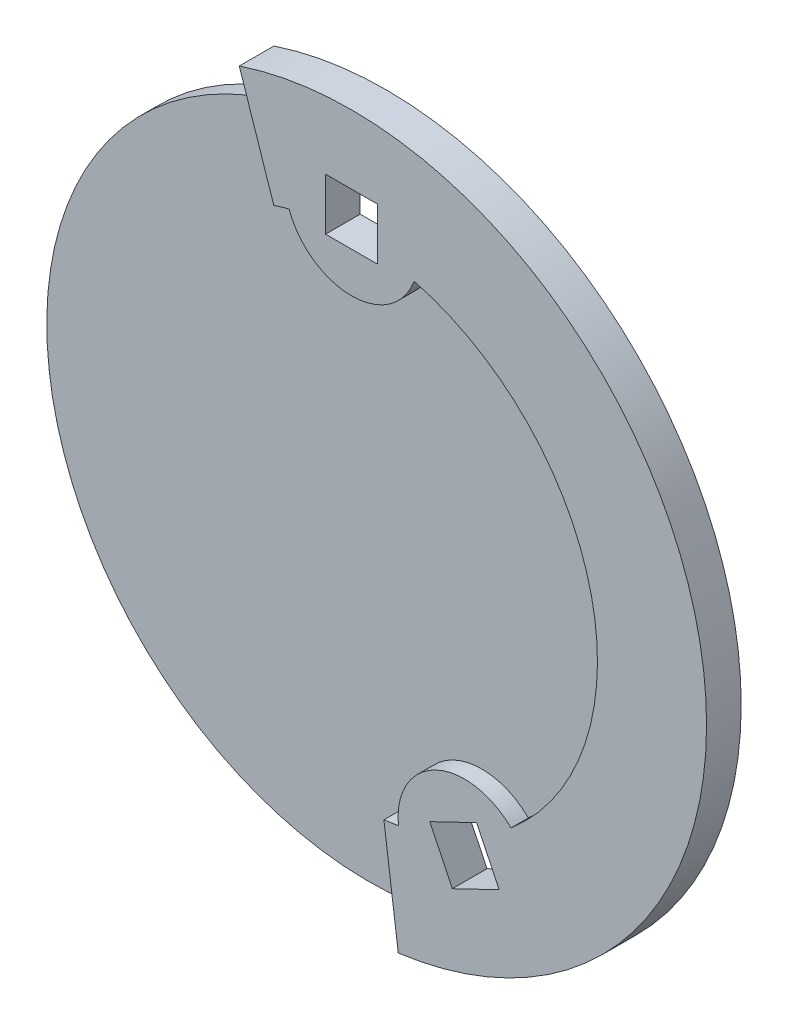
ISO-10303-21;
HEADER;
FILE_DESCRIPTION(('STEP AP214'),'2;1');
FILE_NAME('part.step','',(''),(''),'','','');
FILE_SCHEMA(('AUTOMOTIVE_DESIGN { 1 0 10303 214 1 1 1 1 }'));
ENDSEC;
DATA;
#1=APPLICATION_CONTEXT('core data for automotive mechanical design processes');
#2=APPLICATION_PROTOCOL_DEFINITION('international standard','automotive_design',2000,#1);
#3=PRODUCT_CONTEXT('',#1,'mechanical');
#4=PRODUCT('Part','Part','',(#3));
#5=PRODUCT_RELATED_PRODUCT_CATEGORY('part','',(#4));
#6=PRODUCT_DEFINITION_FORMATION('','',#4);
#7=PRODUCT_DEFINITION_CONTEXT('part definition',#1,'design');
#8=PRODUCT_DEFINITION('design','',#6,#7);
#9=PRODUCT_DEFINITION_SHAPE('','',#8);
#10=(LENGTH_UNIT() NAMED_UNIT(*) SI_UNIT(.MILLI.,.METRE.));
#11=(NAMED_UNIT(*) PLANE_ANGLE_UNIT() SI_UNIT($,.RADIAN.));
#12=(NAMED_UNIT(*) SI_UNIT($,.STERADIAN.) SOLID_ANGLE_UNIT());
#13=UNCERTAINTY_MEASURE_WITH_UNIT(LENGTH_MEASURE(1.E-05),#10,'distance_accuracy_value','');
#14=(GEOMETRIC_REPRESENTATION_CONTEXT(3) GLOBAL_UNCERTAINTY_ASSIGNED_CONTEXT((#13)) GLOBAL_UNIT_ASSIGNED_CONTEXT((#10,
#11,#12)) REPRESENTATION_CONTEXT('',''));
#15=CARTESIAN_POINT('',(0.,0.,0.));
#16=DIRECTION('',(0.,0.,1.));
#17=DIRECTION('',(1.,0.,0.));
#18=AXIS2_PLACEMENT_3D('',#15,#16,#17);
#19=CARTESIAN_POINT('',(0.,0.,1.));
#20=DIRECTION('',(-0.948679561183961,-0.316238976395711,0.));
#21=DIRECTION('',(0.316238976395711,-0.948679561183961,0.));
#22=AXIS2_PLACEMENT_3D('',#19,#20,#21);
#23=PLANE('',#22);
#24=DIRECTION('',(-0.316238976395711,0.948679561183961,0.));
#25=VECTOR('',#24,1.);
#26=CARTESIAN_POINT('',(0.,0.,0.));
#27=LINE('',#26,#25);
#28=CARTESIAN_POINT('',(-5.88204496096024,17.6454398380217,0.));
#29=VERTEX_POINT('',#28);
#30=CARTESIAN_POINT('',(-6.48289901611209,19.4479310042712,0.));
#31=VERTEX_POINT('',#30);
#32=EDGE_CURVE('E310',#29,#31,#27,.T.);
#33=ORIENTED_EDGE('',*,*,#32,.F.);
#34=DIRECTION('',(0.,0.,-1.));
#35=VECTOR('',#34,1.);
#36=CARTESIAN_POINT('',(-5.88204496096024,17.6454398380217,1.));
#37=LINE('',#36,#35);
#38=CARTESIAN_POINT('',(-5.88204496096024,17.6454398380217,1.));
#39=VERTEX_POINT('',#38);
#40=EDGE_CURVE('E312',#39,#29,#37,.T.);
#41=ORIENTED_EDGE('',*,*,#40,.F.);
#42=DIRECTION('',(0.316238976395712,-0.948679561183961,0.));
#43=VECTOR('',#42,1.);
#44=CARTESIAN_POINT('',(-4.49059346481916,13.4712497688124,1.));
#45=LINE('',#44,#43);
#46=CARTESIAN_POINT('',(-4.49059346481916,13.4712497688124,1.));
#47=VERTEX_POINT('',#46);
#48=EDGE_CURVE('E268',#39,#47,#45,.T.);
#49=ORIENTED_EDGE('',*,*,#48,.T.);
#50=DIRECTION('',(0.,0.,-1.));
#51=VECTOR('',#50,1.);
#52=CARTESIAN_POINT('',(-4.49059346481916,13.4712497688124,2.));
#53=LINE('',#52,#51);
#54=CARTESIAN_POINT('',(-4.49059346481916,13.4712497688124,2.));
#55=VERTEX_POINT('',#54);
#56=EDGE_CURVE('E235',#55,#47,#53,.T.);
#57=ORIENTED_EDGE('',*,*,#56,.F.);
#58=DIRECTION('',(0.316238976395712,-0.948679561183961,0.));
#59=VECTOR('',#58,1.);
#60=CARTESIAN_POINT('',(-4.49059346481916,13.4712497688124,2.));
#61=LINE('',#60,#59);
#62=CARTESIAN_POINT('',(-6.48289901611209,19.4479310042712,2.));
#63=VERTEX_POINT('',#62);
#64=EDGE_CURVE('E233',#63,#55,#61,.T.);
#65=ORIENTED_EDGE('',*,*,#64,.F.);
#66=DIRECTION('',(0.,0.,-1.));
#67=VECTOR('',#66,1.);
#68=CARTESIAN_POINT('',(-6.48289901611209,19.4479310042712,1.));
#69=LINE('',#68,#67);
#70=EDGE_CURVE('E315',#63,#31,#69,.T.);
#71=ORIENTED_EDGE('',*,*,#70,.T.);
#72=EDGE_LOOP('',(#33,#41,#49,#57,#65,#71));
#73=FACE_BOUND('',#72,.T.);
#74=ADVANCED_FACE('F38',(#73),#23,.T.);
#75=CARTESIAN_POINT('',(0.,0.,1.));
#76=DIRECTION('',(0.,0.,-1.));
#77=DIRECTION('',(-1.,0.,0.));
#78=AXIS2_PLACEMENT_3D('',#75,#76,#77);
#79=CYLINDRICAL_SURFACE('',#78,18.6);
#80=CARTESIAN_POINT('',(0.,0.,0.));
#81=DIRECTION('',(0.,0.,1.));
#82=DIRECTION('',(1.,0.,0.));
#83=AXIS2_PLACEMENT_3D('',#80,#81,#82);
#84=CIRCLE('',#83,18.6);
#85=CARTESIAN_POINT('',(2.35653002586721,-18.4501156158216,0.));
#86=VERTEX_POINT('',#85);
#87=EDGE_CURVE('E320',#29,#86,#84,.T.);
#88=ORIENTED_EDGE('',*,*,#87,.T.);
#89=DIRECTION('',(0.,0.,-1.));
#90=VECTOR('',#89,1.);
#91=CARTESIAN_POINT('',(2.35653002586721,-18.4501156158216,1.));
#92=LINE('',#91,#90);
#93=CARTESIAN_POINT('',(2.35653002586721,-18.4501156158216,1.));
#94=VERTEX_POINT('',#93);
#95=EDGE_CURVE('E341',#94,#86,#92,.T.);
#96=ORIENTED_EDGE('',*,*,#95,.F.);
#97=CARTESIAN_POINT('',(0.,0.,1.));
#98=DIRECTION('',(0.,0.,1.));
#99=DIRECTION('',(1.,0.,0.));
#100=AXIS2_PLACEMENT_3D('',#97,#98,#99);
#101=CIRCLE('',#100,18.6);
#102=EDGE_CURVE('E335',#39,#94,#101,.T.);
#103=ORIENTED_EDGE('',*,*,#102,.F.);
#104=ORIENTED_EDGE('',*,*,#40,.T.);
#105=EDGE_LOOP('',(#88,#96,#103,#104));
#106=FACE_BOUND('',#105,.T.);
#107=ADVANCED_FACE('F300',(#106),#79,.T.);
#108=CARTESIAN_POINT('',(0.,0.,1.));
#109=DIRECTION('',(0.991941699775358,0.126695162681033,0.));
#110=DIRECTION('',(-0.126695162681033,0.991941699775358,0.));
#111=AXIS2_PLACEMENT_3D('',#108,#109,#110);
#112=PLANE('',#111);
#113=DIRECTION('',(0.126695162681033,-0.991941699775358,0.));
#114=VECTOR('',#113,1.);
#115=CARTESIAN_POINT('',(0.,0.,0.));
#116=LINE('',#115,#114);
#117=CARTESIAN_POINT('',(2.59725083496118,-20.3348048453948,0.));
#118=VERTEX_POINT('',#117);
#119=EDGE_CURVE('E323',#86,#118,#116,.T.);
#120=ORIENTED_EDGE('',*,*,#119,.T.);
#121=DIRECTION('',(0.,0.,-1.));
#122=VECTOR('',#121,1.);
#123=CARTESIAN_POINT('',(2.59725083496118,-20.3348048453948,1.));
#124=LINE('',#123,#122);
#125=CARTESIAN_POINT('',(2.59725083496118,-20.3348048453948,1.));
#126=VERTEX_POINT('',#125);
#127=EDGE_CURVE('E337',#126,#118,#124,.T.);
#128=ORIENTED_EDGE('',*,*,#127,.F.);
#129=DIRECTION('',(0.126695162681033,-0.991941699775358,0.));
#130=VECTOR('',#129,1.);
#131=CARTESIAN_POINT('',(0.,0.,1.));
#132=LINE('',#131,#130);
#133=EDGE_CURVE('E345',#94,#126,#132,.T.);
#134=ORIENTED_EDGE('',*,*,#133,.F.);
#135=ORIENTED_EDGE('',*,*,#95,.T.);
#136=EDGE_LOOP('',(#120,#128,#134,#135));
#137=FACE_BOUND('',#136,.T.);
#138=ADVANCED_FACE('F305',(#137),#112,.F.);
#139=CARTESIAN_POINT('',(0.,0.,1.));
#140=DIRECTION('',(0.,0.,-1.));
#141=DIRECTION('',(-1.,0.,0.));
#142=AXIS2_PLACEMENT_3D('',#139,#140,#141);
#143=CYLINDRICAL_SURFACE('',#142,20.5);
#144=CARTESIAN_POINT('',(0.,0.,0.));
#145=DIRECTION('',(0.,0.,1.));
#146=DIRECTION('',(1.,0.,0.));
#147=AXIS2_PLACEMENT_3D('',#144,#145,#146);
#148=CIRCLE('',#147,20.5);
#149=EDGE_CURVE('E333',#118,#31,#148,.T.);
#150=ORIENTED_EDGE('',*,*,#149,.T.);
#151=ORIENTED_EDGE('',*,*,#70,.F.);
#152=CARTESIAN_POINT('',(0.,0.,2.));
#153=DIRECTION('',(0.,0.,1.));
#154=DIRECTION('',(1.,0.,0.));
#155=AXIS2_PLACEMENT_3D('',#152,#153,#154);
#156=CIRCLE('',#155,20.5);
#157=CARTESIAN_POINT('',(2.69669306776985,-20.3218563743139,2.));
#158=VERTEX_POINT('',#157);
#159=EDGE_CURVE('E230',#158,#63,#156,.T.);
#160=ORIENTED_EDGE('',*,*,#159,.F.);
#161=DIRECTION('',(0.,0.,-1.));
#162=VECTOR('',#161,1.);
#163=CARTESIAN_POINT('',(2.69669306776985,-20.3218563743139,2.));
#164=LINE('',#163,#162);
#165=CARTESIAN_POINT('',(2.69669306776985,-20.3218563743139,1.));
#166=VERTEX_POINT('',#165);
#167=EDGE_CURVE('E259',#158,#166,#164,.T.);
#168=ORIENTED_EDGE('',*,*,#167,.T.);
#169=CARTESIAN_POINT('',(0.,0.,1.));
#170=DIRECTION('',(0.,0.,1.));
#171=DIRECTION('',(1.,0.,0.));
#172=AXIS2_PLACEMENT_3D('',#169,#170,#171);
#173=CIRCLE('',#172,20.5);
#174=EDGE_CURVE('E338',#126,#166,#173,.T.);
#175=ORIENTED_EDGE('',*,*,#174,.F.);
#176=ORIENTED_EDGE('',*,*,#127,.T.);
#177=EDGE_LOOP('',(#150,#151,#160,#168,#175,#176));
#178=FACE_BOUND('',#177,.T.);
#179=ADVANCED_FACE('F393',(#178),#143,.T.);
#180=CARTESIAN_POINT('',(0.,0.,1.));
#181=DIRECTION('',(0.,0.,1.));
#182=DIRECTION('',(1.,0.,0.));
#183=AXIS2_PLACEMENT_3D('',#180,#181,#182);
#184=PLANE('',#183);
#185=ORIENTED_EDGE('',*,*,#48,.F.);
#186=ORIENTED_EDGE('',*,*,#102,.T.);
#187=ORIENTED_EDGE('',*,*,#133,.T.);
#188=ORIENTED_EDGE('',*,*,#174,.T.);
#189=DIRECTION('',(0.131546003305846,-0.991310067039702,0.));
#190=VECTOR('',#189,1.);
#191=CARTESIAN_POINT('',(1.86795324694304,-14.0766029519639,1.));
#192=LINE('',#191,#190);
#193=CARTESIAN_POINT('',(1.86795324694304,-14.0766029519639,1.));
#194=VERTEX_POINT('',#193);
#195=EDGE_CURVE('E220',#194,#166,#192,.T.);
#196=ORIENTED_EDGE('',*,*,#195,.F.);
#197=CARTESIAN_POINT('',(0.,0.,1.));
#198=DIRECTION('',(0.,0.,-1.));
#199=DIRECTION('',(1.,0.,0.));
#200=AXIS2_PLACEMENT_3D('',#197,#198,#199);
#201=CIRCLE('',#200,14.2000000000002);
#202=CARTESIAN_POINT('',(2.70630370509862,-13.9397245401684,1.));
#203=VERTEX_POINT('',#202);
#204=EDGE_CURVE('E247',#203,#194,#201,.T.);
#205=ORIENTED_EDGE('',*,*,#204,.F.);
#206=CARTESIAN_POINT('',(6.52092011060211,-13.5408301350134,1.));
#207=DIRECTION('',(0.,0.,1.));
#208=DIRECTION('',(1.,0.,0.));
#209=AXIS2_PLACEMENT_3D('',#206,#207,#208);
#210=CIRCLE('',#209,3.83541589239033);
#211=CARTESIAN_POINT('',(9.21116274156859,-10.8071495292858,1.));
#212=VERTEX_POINT('',#211);
#213=EDGE_CURVE('E244',#212,#203,#210,.T.);
#214=ORIENTED_EDGE('',*,*,#213,.F.);
#215=CARTESIAN_POINT('',(0.,0.,1.));
#216=DIRECTION('',(0.,0.,-1.));
#217=DIRECTION('',(1.,0.,0.));
#218=AXIS2_PLACEMENT_3D('',#215,#216,#217);
#219=CIRCLE('',#218,14.2000000000002);
#220=CARTESIAN_POINT('',(3.60992442037415,13.733479008583,1.));
#221=VERTEX_POINT('',#220);
#222=EDGE_CURVE('E241',#221,#212,#219,.T.);
#223=ORIENTED_EDGE('',*,*,#222,.F.);
#224=CARTESIAN_POINT('',(3.90616358703078E-12,15.0291875972769,1.));
#225=DIRECTION('',(0.,0.,1.));
#226=DIRECTION('',(1.,0.,0.));
#227=AXIS2_PLACEMENT_3D('',#224,#225,#226);
#228=CIRCLE('',#227,3.83541589239035);
#229=CARTESIAN_POINT('',(-3.60992442036701,13.7334790085849,1.));
#230=VERTEX_POINT('',#229);
#231=EDGE_CURVE('E238',#230,#221,#228,.T.);
#232=ORIENTED_EDGE('',*,*,#231,.F.);
#233=CARTESIAN_POINT('',(0.,0.,1.));
#234=DIRECTION('',(0.,0.,-1.));
#235=DIRECTION('',(1.,0.,0.));
#236=AXIS2_PLACEMENT_3D('',#233,#234,#235);
#237=CIRCLE('',#236,14.2000000000002);
#238=EDGE_CURVE('E209',#47,#230,#237,.T.);
#239=ORIENTED_EDGE('',*,*,#238,.F.);
#240=EDGE_LOOP('',(#185,#186,#187,#188,#196,#205,#214,#223,#232,#239));
#241=FACE_BOUND('',#240,.T.);
#242=ADVANCED_FACE('F373',(#241),#184,.T.);
#243=CARTESIAN_POINT('',(0.,0.,0.));
#244=DIRECTION('',(0.,0.,1.));
#245=DIRECTION('',(1.,0.,0.));
#246=AXIS2_PLACEMENT_3D('',#243,#244,#245);
#247=PLANE('',#246);
#248=DIRECTION('',(-0.90096886790242,-0.433883739117555,0.));
#249=VECTOR('',#248,1.);
#250=CARTESIAN_POINT('',(5.82029241742415,-15.5431090455452,0.));
#251=LINE('',#250,#249);
#252=CARTESIAN_POINT('',(8.523199021134,-14.2414578281913,0.));
#253=VERTEX_POINT('',#252);
#254=CARTESIAN_POINT('',(5.82029241742415,-15.5431090455452,0.));
#255=VERTEX_POINT('',#254);
#256=EDGE_CURVE('E179',#253,#255,#251,.T.);
#257=ORIENTED_EDGE('',*,*,#256,.F.);
#258=DIRECTION('',(0.433883739117555,-0.900968867902421,0.));
#259=VECTOR('',#258,1.);
#260=CARTESIAN_POINT('',(8.523199021134,-14.2414578281913,0.));
#261=LINE('',#260,#259);
#262=CARTESIAN_POINT('',(7.22154780378009,-11.5385512244815,0.));
#263=VERTEX_POINT('',#262);
#264=EDGE_CURVE('E52',#263,#253,#261,.T.);
#265=ORIENTED_EDGE('',*,*,#264,.F.);
#266=DIRECTION('',(0.90096886790242,0.433883739117556,0.));
#267=VECTOR('',#266,1.);
#268=CARTESIAN_POINT('',(7.22154780378009,-11.5385512244815,0.));
#269=LINE('',#268,#267);
#270=CARTESIAN_POINT('',(4.51864120007024,-12.8402024418354,0.));
#271=VERTEX_POINT('',#270);
#272=EDGE_CURVE('E186',#271,#263,#269,.T.);
#273=ORIENTED_EDGE('',*,*,#272,.F.);
#274=DIRECTION('',(-0.433883739117555,0.900968867902421,0.));
#275=VECTOR('',#274,1.);
#276=CARTESIAN_POINT('',(4.51864120007024,-12.8402024418354,0.));
#277=LINE('',#276,#275);
#278=EDGE_CURVE('E170',#255,#271,#277,.T.);
#279=ORIENTED_EDGE('',*,*,#278,.F.);
#280=EDGE_LOOP('',(#257,#265,#273,#279));
#281=FACE_BOUND('',#280,.T.);
#282=DIRECTION('',(-1.,0.,0.));
#283=VECTOR('',#282,1.);
#284=CARTESIAN_POINT('',(-1.49999999999752,13.5291875972754,0.));
#285=LINE('',#284,#283);
#286=CARTESIAN_POINT('',(1.50000000000534,13.5291875972755,0.));
#287=VERTEX_POINT('',#286);
#288=CARTESIAN_POINT('',(-1.49999999999752,13.5291875972754,0.));
#289=VERTEX_POINT('',#288);
#290=EDGE_CURVE('E197',#287,#289,#285,.T.);
#291=ORIENTED_EDGE('',*,*,#290,.F.);
#292=DIRECTION('',(0.,-1.,0.));
#293=VECTOR('',#292,1.);
#294=CARTESIAN_POINT('',(1.50000000000534,13.5291875972755,0.));
#295=LINE('',#294,#293);
#296=CARTESIAN_POINT('',(1.50000000000533,16.5291875972783,0.));
#297=VERTEX_POINT('',#296);
#298=EDGE_CURVE('E193',#297,#287,#295,.T.);
#299=ORIENTED_EDGE('',*,*,#298,.F.);
#300=DIRECTION('',(1.,0.,0.));
#301=VECTOR('',#300,1.);
#302=CARTESIAN_POINT('',(1.50000000000533,16.5291875972783,0.));
#303=LINE('',#302,#301);
#304=CARTESIAN_POINT('',(-1.49999999999753,16.5291875972783,0.));
#305=VERTEX_POINT('',#304);
#306=EDGE_CURVE('E203',#305,#297,#303,.T.);
#307=ORIENTED_EDGE('',*,*,#306,.F.);
#308=DIRECTION('',(0.,1.,0.));
#309=VECTOR('',#308,1.);
#310=CARTESIAN_POINT('',(-1.49999999999753,16.5291875972783,0.));
#311=LINE('',#310,#309);
#312=EDGE_CURVE('E200',#289,#305,#311,.T.);
#313=ORIENTED_EDGE('',*,*,#312,.F.);
#314=EDGE_LOOP('',(#291,#299,#307,#313));
#315=FACE_BOUND('',#314,.T.);
#316=ORIENTED_EDGE('',*,*,#32,.T.);
#317=ORIENTED_EDGE('',*,*,#149,.F.);
#318=ORIENTED_EDGE('',*,*,#119,.F.);
#319=ORIENTED_EDGE('',*,*,#87,.F.);
#320=EDGE_LOOP('',(#316,#317,#318,#319));
#321=FACE_BOUND('',#320,.T.);
#322=ADVANCED_FACE('F183',(#281,#315,#321),#247,.F.);
#323=CARTESIAN_POINT('',(0.,0.,2.));
#324=DIRECTION('',(0.,0.,-1.));
#325=DIRECTION('',(-1.,0.,0.));
#326=AXIS2_PLACEMENT_3D('',#323,#324,#325);
#327=CYLINDRICAL_SURFACE('',#326,14.2000000000002);
#328=ORIENTED_EDGE('',*,*,#238,.T.);
#329=DIRECTION('',(0.,0.,-1.));
#330=VECTOR('',#329,1.);
#331=CARTESIAN_POINT('',(-3.60992442036701,13.7334790085849,2.));
#332=LINE('',#331,#330);
#333=CARTESIAN_POINT('',(-3.60992442036701,13.7334790085849,2.));
#334=VERTEX_POINT('',#333);
#335=EDGE_CURVE('E321',#334,#230,#332,.T.);
#336=ORIENTED_EDGE('',*,*,#335,.F.);
#337=CARTESIAN_POINT('',(0.,0.,2.));
#338=DIRECTION('',(0.,0.,-1.));
#339=DIRECTION('',(1.,0.,0.));
#340=AXIS2_PLACEMENT_3D('',#337,#338,#339);
#341=CIRCLE('',#340,14.2000000000002);
#342=EDGE_CURVE('E216',#55,#334,#341,.T.);
#343=ORIENTED_EDGE('',*,*,#342,.F.);
#344=ORIENTED_EDGE('',*,*,#56,.T.);
#345=EDGE_LOOP('',(#328,#336,#343,#344));
#346=FACE_BOUND('',#345,.T.);
#347=ADVANCED_FACE('F388',(#346),#327,.F.);
#348=CARTESIAN_POINT('',(3.90616358703078E-12,15.0291875972769,2.));
#349=DIRECTION('',(0.,0.,-1.));
#350=DIRECTION('',(-1.,0.,0.));
#351=AXIS2_PLACEMENT_3D('',#348,#349,#350);
#352=CYLINDRICAL_SURFACE('',#351,3.83541589239035);
#353=ORIENTED_EDGE('',*,*,#231,.T.);
#354=DIRECTION('',(0.,0.,-1.));
#355=VECTOR('',#354,1.);
#356=CARTESIAN_POINT('',(3.60992442037415,13.733479008583,2.));
#357=LINE('',#356,#355);
#358=CARTESIAN_POINT('',(3.60992442037415,13.733479008583,2.));
#359=VERTEX_POINT('',#358);
#360=EDGE_CURVE('E326',#359,#221,#357,.T.);
#361=ORIENTED_EDGE('',*,*,#360,.F.);
#362=CARTESIAN_POINT('',(3.90616358703078E-12,15.0291875972769,2.));
#363=DIRECTION('',(0.,0.,1.));
#364=DIRECTION('',(1.,0.,0.));
#365=AXIS2_PLACEMENT_3D('',#362,#363,#364);
#366=CIRCLE('',#365,3.83541589239035);
#367=EDGE_CURVE('E219',#334,#359,#366,.T.);
#368=ORIENTED_EDGE('',*,*,#367,.F.);
#369=ORIENTED_EDGE('',*,*,#335,.T.);
#370=EDGE_LOOP('',(#353,#361,#368,#369));
#371=FACE_BOUND('',#370,.T.);
#372=ADVANCED_FACE('F383',(#371),#352,.T.);
#373=CARTESIAN_POINT('',(0.,0.,2.));
#374=DIRECTION('',(0.,0.,-1.));
#375=DIRECTION('',(-1.,0.,0.));
#376=AXIS2_PLACEMENT_3D('',#373,#374,#375);
#377=CYLINDRICAL_SURFACE('',#376,14.2000000000002);
#378=ORIENTED_EDGE('',*,*,#222,.T.);
#379=DIRECTION('',(0.,0.,-1.));
#380=VECTOR('',#379,1.);
#381=CARTESIAN_POINT('',(9.21116274156859,-10.8071495292858,2.));
#382=LINE('',#381,#380);
#383=CARTESIAN_POINT('',(9.21116274156859,-10.8071495292858,2.));
#384=VERTEX_POINT('',#383);
#385=EDGE_CURVE('E358',#384,#212,#382,.T.);
#386=ORIENTED_EDGE('',*,*,#385,.F.);
#387=CARTESIAN_POINT('',(0.,0.,2.));
#388=DIRECTION('',(0.,0.,-1.));
#389=DIRECTION('',(1.,0.,0.));
#390=AXIS2_PLACEMENT_3D('',#387,#388,#389);
#391=CIRCLE('',#390,14.2000000000002);
#392=EDGE_CURVE('E222',#359,#384,#391,.T.);
#393=ORIENTED_EDGE('',*,*,#392,.F.);
#394=ORIENTED_EDGE('',*,*,#360,.T.);
#395=EDGE_LOOP('',(#378,#386,#393,#394));
#396=FACE_BOUND('',#395,.T.);
#397=ADVANCED_FACE('F380',(#396),#377,.F.);
#398=CARTESIAN_POINT('',(6.52092011060211,-13.5408301350134,2.));
#399=DIRECTION('',(0.,0.,-1.));
#400=DIRECTION('',(-1.,0.,0.));
#401=AXIS2_PLACEMENT_3D('',#398,#399,#400);
#402=CYLINDRICAL_SURFACE('',#401,3.83541589239033);
#403=ORIENTED_EDGE('',*,*,#213,.T.);
#404=DIRECTION('',(0.,0.,-1.));
#405=VECTOR('',#404,1.);
#406=CARTESIAN_POINT('',(2.70630370509862,-13.9397245401684,2.));
#407=LINE('',#406,#405);
#408=CARTESIAN_POINT('',(2.70630370509862,-13.9397245401684,2.));
#409=VERTEX_POINT('',#408);
#410=EDGE_CURVE('E361',#409,#203,#407,.T.);
#411=ORIENTED_EDGE('',*,*,#410,.F.);
#412=CARTESIAN_POINT('',(6.52092011060211,-13.5408301350134,2.));
#413=DIRECTION('',(0.,0.,1.));
#414=DIRECTION('',(1.,0.,0.));
#415=AXIS2_PLACEMENT_3D('',#412,#413,#414);
#416=CIRCLE('',#415,3.83541589239033);
#417=EDGE_CURVE('E224',#384,#409,#416,.T.);
#418=ORIENTED_EDGE('',*,*,#417,.F.);
#419=ORIENTED_EDGE('',*,*,#385,.T.);
#420=EDGE_LOOP('',(#403,#411,#418,#419));
#421=FACE_BOUND('',#420,.T.);
#422=ADVANCED_FACE('F375',(#421),#402,.T.);
#423=CARTESIAN_POINT('',(0.,0.,2.));
#424=DIRECTION('',(0.,0.,-1.));
#425=DIRECTION('',(-1.,0.,0.));
#426=AXIS2_PLACEMENT_3D('',#423,#424,#425);
#427=CYLINDRICAL_SURFACE('',#426,14.2000000000002);
#428=ORIENTED_EDGE('',*,*,#204,.T.);
#429=DIRECTION('',(0.,0.,-1.));
#430=VECTOR('',#429,1.);
#431=CARTESIAN_POINT('',(1.86795324694304,-14.0766029519639,2.));
#432=LINE('',#431,#430);
#433=CARTESIAN_POINT('',(1.86795324694304,-14.0766029519639,2.));
#434=VERTEX_POINT('',#433);
#435=EDGE_CURVE('E262',#434,#194,#432,.T.);
#436=ORIENTED_EDGE('',*,*,#435,.F.);
#437=CARTESIAN_POINT('',(0.,0.,2.));
#438=DIRECTION('',(0.,0.,-1.));
#439=DIRECTION('',(1.,0.,0.));
#440=AXIS2_PLACEMENT_3D('',#437,#438,#439);
#441=CIRCLE('',#440,14.2000000000002);
#442=EDGE_CURVE('E226',#409,#434,#441,.T.);
#443=ORIENTED_EDGE('',*,*,#442,.F.);
#444=ORIENTED_EDGE('',*,*,#410,.T.);
#445=EDGE_LOOP('',(#428,#436,#443,#444));
#446=FACE_BOUND('',#445,.T.);
#447=ADVANCED_FACE('F371',(#446),#427,.F.);
#448=CARTESIAN_POINT('',(1.86795324694304,-14.0766029519639,2.));
#449=DIRECTION('',(0.991310067039702,0.131546003305846,0.));
#450=DIRECTION('',(-0.131546003305846,0.991310067039702,0.));
#451=AXIS2_PLACEMENT_3D('',#448,#449,#450);
#452=PLANE('',#451);
#453=ORIENTED_EDGE('',*,*,#195,.T.);
#454=ORIENTED_EDGE('',*,*,#167,.F.);
#455=DIRECTION('',(0.131546003305846,-0.991310067039702,0.));
#456=VECTOR('',#455,1.);
#457=CARTESIAN_POINT('',(1.86795324694304,-14.0766029519639,2.));
#458=LINE('',#457,#456);
#459=EDGE_CURVE('E228',#434,#158,#458,.T.);
#460=ORIENTED_EDGE('',*,*,#459,.F.);
#461=ORIENTED_EDGE('',*,*,#435,.T.);
#462=EDGE_LOOP('',(#453,#454,#460,#461));
#463=FACE_BOUND('',#462,.T.);
#464=ADVANCED_FACE('F367',(#463),#452,.F.);
#465=CARTESIAN_POINT('',(0.,0.,2.));
#466=DIRECTION('',(0.,0.,1.));
#467=DIRECTION('',(1.,0.,0.));
#468=AXIS2_PLACEMENT_3D('',#465,#466,#467);
#469=PLANE('',#468);
#470=DIRECTION('',(-0.433883739117555,0.900968867902421,0.));
#471=VECTOR('',#470,1.);
#472=CARTESIAN_POINT('',(1.35145330185137,0.650825608675243,2.));
#473=LINE('',#472,#471);
#474=CARTESIAN_POINT('',(8.523199021134,-14.2414578281913,2.));
#475=VERTEX_POINT('',#474);
#476=CARTESIAN_POINT('',(7.22154780378009,-11.5385512244815,2.));
#477=VERTEX_POINT('',#476);
#478=EDGE_CURVE('E11',#475,#477,#473,.T.);
#479=ORIENTED_EDGE('',*,*,#478,.F.);
#480=DIRECTION('',(0.900968867902421,0.433883739117555,0.));
#481=VECTOR('',#480,1.);
#482=CARTESIAN_POINT('',(7.17174571928263,-14.8922834368666,2.));
#483=LINE('',#482,#481);
#484=CARTESIAN_POINT('',(5.82029241742415,-15.5431090455452,2.));
#485=VERTEX_POINT('',#484);
#486=EDGE_CURVE('E275',#485,#475,#483,.T.);
#487=ORIENTED_EDGE('',*,*,#486,.F.);
#488=DIRECTION('',(0.433883739117555,-0.900968867902421,0.));
#489=VECTOR('',#488,1.);
#490=CARTESIAN_POINT('',(-1.35145330185848,-0.650825608678668,2.));
#491=LINE('',#490,#489);
#492=CARTESIAN_POINT('',(4.51864120007024,-12.8402024418354,2.));
#493=VERTEX_POINT('',#492);
#494=EDGE_CURVE('E173',#493,#485,#491,.T.);
#495=ORIENTED_EDGE('',*,*,#494,.F.);
#496=DIRECTION('',(-0.90096886790242,-0.433883739117556,0.));
#497=VECTOR('',#496,1.);
#498=CARTESIAN_POINT('',(5.87009450192873,-12.1893768331567,2.));
#499=LINE('',#498,#497);
#500=EDGE_CURVE('E45',#477,#493,#499,.T.);
#501=ORIENTED_EDGE('',*,*,#500,.F.);
#502=EDGE_LOOP('',(#479,#487,#495,#501));
#503=FACE_BOUND('',#502,.T.);
#504=DIRECTION('',(0.,1.,0.));
#505=VECTOR('',#504,1.);
#506=CARTESIAN_POINT('',(1.50000000000538,0.,2.));
#507=LINE('',#506,#505);
#508=CARTESIAN_POINT('',(1.50000000000534,13.5291875972755,2.));
#509=VERTEX_POINT('',#508);
#510=CARTESIAN_POINT('',(1.50000000000533,16.5291875972783,2.));
#511=VERTEX_POINT('',#510);
#512=EDGE_CURVE('E273',#509,#511,#507,.T.);
#513=ORIENTED_EDGE('',*,*,#512,.F.);
#514=DIRECTION('',(1.,0.,0.));
#515=VECTOR('',#514,1.);
#516=CARTESIAN_POINT('',(0.,13.5291875972755,2.));
#517=LINE('',#516,#515);
#518=CARTESIAN_POINT('',(-1.49999999999752,13.5291875972754,2.));
#519=VERTEX_POINT('',#518);
#520=EDGE_CURVE('E265',#519,#509,#517,.T.);
#521=ORIENTED_EDGE('',*,*,#520,.F.);
#522=DIRECTION('',(0.,-1.,0.));
#523=VECTOR('',#522,1.);
#524=CARTESIAN_POINT('',(-1.49999999999749,0.,2.));
#525=LINE('',#524,#523);
#526=CARTESIAN_POINT('',(-1.49999999999753,16.5291875972783,2.));
#527=VERTEX_POINT('',#526);
#528=EDGE_CURVE('E267',#527,#519,#525,.T.);
#529=ORIENTED_EDGE('',*,*,#528,.F.);
#530=DIRECTION('',(-1.,0.,0.));
#531=VECTOR('',#530,1.);
#532=CARTESIAN_POINT('',(0.,16.5291875972783,2.));
#533=LINE('',#532,#531);
#534=EDGE_CURVE('E271',#511,#527,#533,.T.);
#535=ORIENTED_EDGE('',*,*,#534,.F.);
#536=EDGE_LOOP('',(#513,#521,#529,#535));
#537=FACE_BOUND('',#536,.T.);
#538=ORIENTED_EDGE('',*,*,#342,.T.);
#539=ORIENTED_EDGE('',*,*,#367,.T.);
#540=ORIENTED_EDGE('',*,*,#392,.T.);
#541=ORIENTED_EDGE('',*,*,#417,.T.);
#542=ORIENTED_EDGE('',*,*,#442,.T.);
#543=ORIENTED_EDGE('',*,*,#459,.T.);
#544=ORIENTED_EDGE('',*,*,#159,.T.);
#545=ORIENTED_EDGE('',*,*,#64,.T.);
#546=EDGE_LOOP('',(#538,#539,#540,#541,#542,#543,#544,#545));
#547=FACE_BOUND('',#546,.T.);
#548=ADVANCED_FACE('F283',(#503,#537,#547),#469,.T.);
#549=CARTESIAN_POINT('',(1.50000000000534,13.5291875972755,2.000025));
#550=DIRECTION('',(1.,0.,0.));
#551=DIRECTION('',(0.,1.,0.));
#552=AXIS2_PLACEMENT_3D('',#549,#550,#551);
#553=PLANE('',#552);
#554=ORIENTED_EDGE('',*,*,#512,.T.);
#555=DIRECTION('',(0.,0.,-1.));
#556=VECTOR('',#555,1.);
#557=CARTESIAN_POINT('',(1.50000000000533,16.5291875972783,2.000025));
#558=LINE('',#557,#556);
#559=EDGE_CURVE('E207',#511,#297,#558,.T.);
#560=ORIENTED_EDGE('',*,*,#559,.T.);
#561=ORIENTED_EDGE('',*,*,#298,.T.);
#562=DIRECTION('',(0.,0.,-1.));
#563=VECTOR('',#562,1.);
#564=CARTESIAN_POINT('',(1.50000000000534,13.5291875972755,2.000025));
#565=LINE('',#564,#563);
#566=EDGE_CURVE('E206',#509,#287,#565,.T.);
#567=ORIENTED_EDGE('',*,*,#566,.F.);
#568=EDGE_LOOP('',(#554,#560,#561,#567));
#569=FACE_BOUND('',#568,.T.);
#570=ADVANCED_FACE('F422',(#569),#553,.F.);
#571=CARTESIAN_POINT('',(1.50000000000533,16.5291875972783,2.000025));
#572=DIRECTION('',(0.,1.,0.));
#573=DIRECTION('',(-1.,0.,0.));
#574=AXIS2_PLACEMENT_3D('',#571,#572,#573);
#575=PLANE('',#574);
#576=ORIENTED_EDGE('',*,*,#534,.T.);
#577=DIRECTION('',(0.,0.,-1.));
#578=VECTOR('',#577,1.);
#579=CARTESIAN_POINT('',(-1.49999999999753,16.5291875972783,2.000025));
#580=LINE('',#579,#578);
#581=EDGE_CURVE('E210',#527,#305,#580,.T.);
#582=ORIENTED_EDGE('',*,*,#581,.T.);
#583=ORIENTED_EDGE('',*,*,#306,.T.);
#584=ORIENTED_EDGE('',*,*,#559,.F.);
#585=EDGE_LOOP('',(#576,#582,#583,#584));
#586=FACE_BOUND('',#585,.T.);
#587=ADVANCED_FACE('F424',(#586),#575,.F.);
#588=CARTESIAN_POINT('',(-1.49999999999753,16.5291875972783,2.000025));
#589=DIRECTION('',(-1.,0.,0.));
#590=DIRECTION('',(0.,-1.,0.));
#591=AXIS2_PLACEMENT_3D('',#588,#589,#590);
#592=PLANE('',#591);
#593=ORIENTED_EDGE('',*,*,#528,.T.);
#594=DIRECTION('',(0.,0.,-1.));
#595=VECTOR('',#594,1.);
#596=CARTESIAN_POINT('',(-1.49999999999752,13.5291875972754,2.000025));
#597=LINE('',#596,#595);
#598=EDGE_CURVE('E212',#519,#289,#597,.T.);
#599=ORIENTED_EDGE('',*,*,#598,.T.);
#600=ORIENTED_EDGE('',*,*,#312,.T.);
#601=ORIENTED_EDGE('',*,*,#581,.F.);
#602=EDGE_LOOP('',(#593,#599,#600,#601));
#603=FACE_BOUND('',#602,.T.);
#604=ADVANCED_FACE('F294',(#603),#592,.F.);
#605=CARTESIAN_POINT('',(-1.49999999999752,13.5291875972754,2.000025));
#606=DIRECTION('',(0.,-1.,0.));
#607=DIRECTION('',(1.,0.,0.));
#608=AXIS2_PLACEMENT_3D('',#605,#606,#607);
#609=PLANE('',#608);
#610=ORIENTED_EDGE('',*,*,#520,.T.);
#611=ORIENTED_EDGE('',*,*,#566,.T.);
#612=ORIENTED_EDGE('',*,*,#290,.T.);
#613=ORIENTED_EDGE('',*,*,#598,.F.);
#614=EDGE_LOOP('',(#610,#611,#612,#613));
#615=FACE_BOUND('',#614,.T.);
#616=ADVANCED_FACE('F287',(#615),#609,.F.);
#617=CARTESIAN_POINT('',(8.523199021134,-14.2414578281913,2.000025));
#618=DIRECTION('',(0.900968867902421,0.433883739117555,0.));
#619=DIRECTION('',(-0.433883739117555,0.900968867902421,0.));
#620=AXIS2_PLACEMENT_3D('',#617,#618,#619);
#621=PLANE('',#620);
#622=ORIENTED_EDGE('',*,*,#478,.T.);
#623=DIRECTION('',(0.,0.,-1.));
#624=VECTOR('',#623,1.);
#625=CARTESIAN_POINT('',(7.22154780378009,-11.5385512244815,2.000025));
#626=LINE('',#625,#624);
#627=EDGE_CURVE('E191',#477,#263,#626,.T.);
#628=ORIENTED_EDGE('',*,*,#627,.T.);
#629=ORIENTED_EDGE('',*,*,#264,.T.);
#630=DIRECTION('',(0.,0.,-1.));
#631=VECTOR('',#630,1.);
#632=CARTESIAN_POINT('',(8.523199021134,-14.2414578281913,2.000025));
#633=LINE('',#632,#631);
#634=EDGE_CURVE('E176',#475,#253,#633,.T.);
#635=ORIENTED_EDGE('',*,*,#634,.F.);
#636=EDGE_LOOP('',(#622,#628,#629,#635));
#637=FACE_BOUND('',#636,.T.);
#638=ADVANCED_FACE('F285',(#637),#621,.F.);
#639=CARTESIAN_POINT('',(7.22154780378009,-11.5385512244815,2.000025));
#640=DIRECTION('',(-0.433883739117555,0.90096886790242,0.));
#641=DIRECTION('',(-0.90096886790242,-0.433883739117556,0.));
#642=AXIS2_PLACEMENT_3D('',#639,#640,#641);
#643=PLANE('',#642);
#644=ORIENTED_EDGE('',*,*,#500,.T.);
#645=DIRECTION('',(0.,0.,-1.));
#646=VECTOR('',#645,1.);
#647=CARTESIAN_POINT('',(4.51864120007024,-12.8402024418354,2.000025));
#648=LINE('',#647,#646);
#649=EDGE_CURVE('E175',#493,#271,#648,.T.);
#650=ORIENTED_EDGE('',*,*,#649,.T.);
#651=ORIENTED_EDGE('',*,*,#272,.T.);
#652=ORIENTED_EDGE('',*,*,#627,.F.);
#653=EDGE_LOOP('',(#644,#650,#651,#652));
#654=FACE_BOUND('',#653,.T.);
#655=ADVANCED_FACE('F280',(#654),#643,.F.);
#656=CARTESIAN_POINT('',(4.51864120007024,-12.8402024418354,2.000025));
#657=DIRECTION('',(-0.900968867902421,-0.433883739117555,0.));
#658=DIRECTION('',(0.433883739117555,-0.900968867902421,0.));
#659=AXIS2_PLACEMENT_3D('',#656,#657,#658);
#660=PLANE('',#659);
#661=ORIENTED_EDGE('',*,*,#494,.T.);
#662=DIRECTION('',(0.,0.,-1.));
#663=VECTOR('',#662,1.);
#664=CARTESIAN_POINT('',(5.82029241742415,-15.5431090455452,2.000025));
#665=LINE('',#664,#663);
#666=EDGE_CURVE('E60',#485,#255,#665,.T.);
#667=ORIENTED_EDGE('',*,*,#666,.T.);
#668=ORIENTED_EDGE('',*,*,#278,.T.);
#669=ORIENTED_EDGE('',*,*,#649,.F.);
#670=EDGE_LOOP('',(#661,#667,#668,#669));
#671=FACE_BOUND('',#670,.T.);
#672=ADVANCED_FACE('F167',(#671),#660,.F.);
#673=CARTESIAN_POINT('',(5.82029241742415,-15.5431090455452,2.000025));
#674=DIRECTION('',(0.433883739117555,-0.90096886790242,0.));
#675=DIRECTION('',(0.900968867902421,0.433883739117555,0.));
#676=AXIS2_PLACEMENT_3D('',#673,#674,#675);
#677=PLANE('',#676);
#678=ORIENTED_EDGE('',*,*,#486,.T.);
#679=ORIENTED_EDGE('',*,*,#634,.T.);
#680=ORIENTED_EDGE('',*,*,#256,.T.);
#681=ORIENTED_EDGE('',*,*,#666,.F.);
#682=EDGE_LOOP('',(#678,#679,#680,#681));
#683=FACE_BOUND('',#682,.T.);
#684=ADVANCED_FACE('F180',(#683),#677,.F.);
#685=CLOSED_SHELL('',(#74,#107,#138,#179,#242,#322,#347,#372,#397,#422,#447,#464,#548,#570,#587,
#604,#616,#638,#655,#672,#684));
#686=MANIFOLD_SOLID_BREP('B2',#685);
#687=ADVANCED_BREP_SHAPE_REPRESENTATION('',(#18,#686),#14);
#688=SHAPE_DEFINITION_REPRESENTATION(#9,#687);
ENDSEC;
END-ISO-10303-21;
